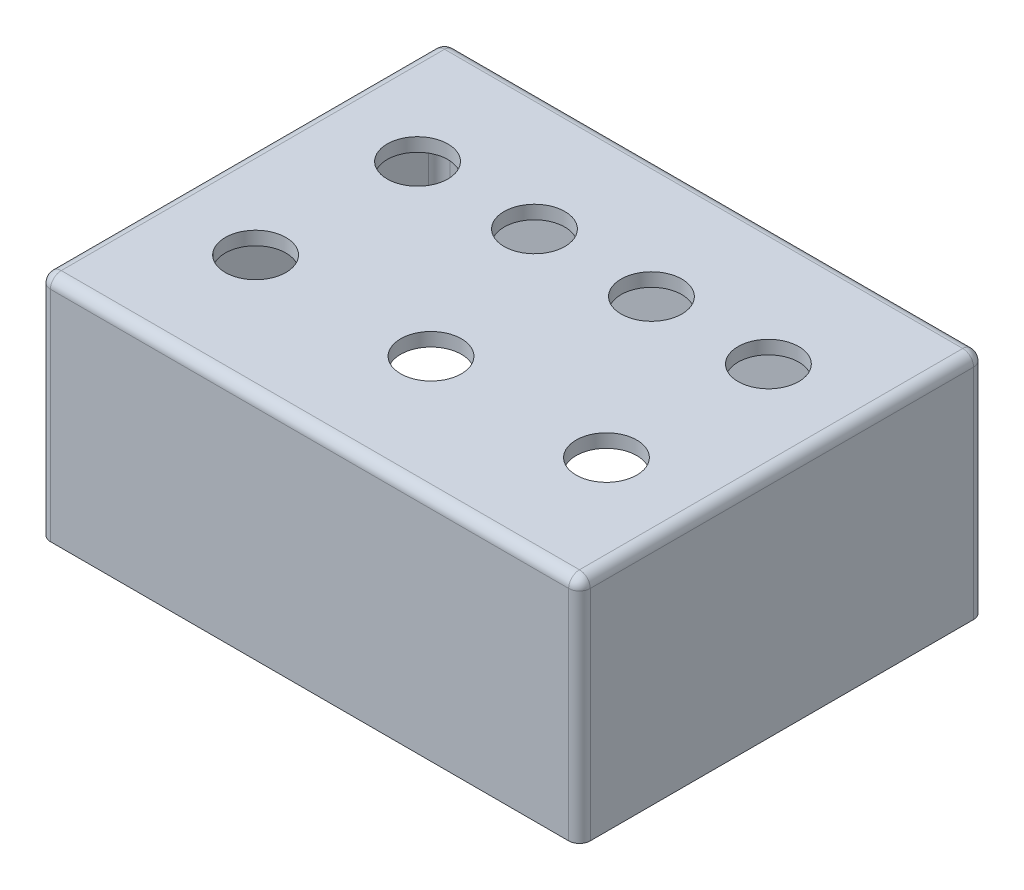
ISO-10303-21;
HEADER;
FILE_DESCRIPTION(('STEP AP214'),'2;1');
FILE_NAME('part.step','',(''),(''),'','','');
FILE_SCHEMA(('AUTOMOTIVE_DESIGN { 1 0 10303 214 1 1 1 1 }'));
ENDSEC;
DATA;
#1=APPLICATION_CONTEXT('core data for automotive mechanical design processes');
#2=APPLICATION_PROTOCOL_DEFINITION('international standard','automotive_design',2000,#1);
#3=PRODUCT_CONTEXT('',#1,'mechanical');
#4=PRODUCT('Part','Part','',(#3));
#5=PRODUCT_RELATED_PRODUCT_CATEGORY('part','',(#4));
#6=PRODUCT_DEFINITION_FORMATION('','',#4);
#7=PRODUCT_DEFINITION_CONTEXT('part definition',#1,'design');
#8=PRODUCT_DEFINITION('design','',#6,#7);
#9=PRODUCT_DEFINITION_SHAPE('','',#8);
#10=(LENGTH_UNIT() NAMED_UNIT(*) SI_UNIT(.MILLI.,.METRE.));
#11=(NAMED_UNIT(*) PLANE_ANGLE_UNIT() SI_UNIT($,.RADIAN.));
#12=(NAMED_UNIT(*) SI_UNIT($,.STERADIAN.) SOLID_ANGLE_UNIT());
#13=UNCERTAINTY_MEASURE_WITH_UNIT(LENGTH_MEASURE(1.E-05),#10,'distance_accuracy_value','');
#14=(GEOMETRIC_REPRESENTATION_CONTEXT(3) GLOBAL_UNCERTAINTY_ASSIGNED_CONTEXT((#13)) GLOBAL_UNIT_ASSIGNED_CONTEXT((#10,
#11,#12)) REPRESENTATION_CONTEXT('',''));
#15=CARTESIAN_POINT('',(0.,0.,0.));
#16=DIRECTION('',(0.,0.,1.));
#17=DIRECTION('',(1.,0.,0.));
#18=AXIS2_PLACEMENT_3D('',#15,#16,#17);
#19=CARTESIAN_POINT('',(0.,0.,0.));
#20=DIRECTION('',(0.,1.,0.));
#21=DIRECTION('',(0.,0.,1.));
#22=AXIS2_PLACEMENT_3D('',#19,#20,#21);
#23=PLANE('',#22);
#24=DIRECTION('',(0.,0.,1.));
#25=VECTOR('',#24,1.);
#26=CARTESIAN_POINT('',(-93.,0.,-70.));
#27=LINE('',#26,#25);
#28=CARTESIAN_POINT('',(-93.,0.,66.));
#29=VERTEX_POINT('',#28);
#30=CARTESIAN_POINT('',(-93.,0.,-66.));
#31=VERTEX_POINT('',#30);
#32=EDGE_CURVE('E360',#29,#31,#27,.F.);
#33=ORIENTED_EDGE('',*,*,#32,.T.);
#34=DIRECTION('',(-1.,0.,0.));
#35=VECTOR('',#34,1.);
#36=CARTESIAN_POINT('',(97.,0.,-66.));
#37=LINE('',#36,#35);
#38=CARTESIAN_POINT('',(93.,0.,-66.));
#39=VERTEX_POINT('',#38);
#40=EDGE_CURVE('E368',#31,#39,#37,.F.);
#41=ORIENTED_EDGE('',*,*,#40,.T.);
#42=DIRECTION('',(0.,0.,-1.));
#43=VECTOR('',#42,1.);
#44=CARTESIAN_POINT('',(93.,0.,70.));
#45=LINE('',#44,#43);
#46=CARTESIAN_POINT('',(93.,0.,66.));
#47=VERTEX_POINT('',#46);
#48=EDGE_CURVE('E71',#39,#47,#45,.F.);
#49=ORIENTED_EDGE('',*,*,#48,.T.);
#50=DIRECTION('',(1.,0.,0.));
#51=VECTOR('',#50,1.);
#52=CARTESIAN_POINT('',(-97.,0.,66.));
#53=LINE('',#52,#51);
#54=EDGE_CURVE('E363',#47,#29,#53,.F.);
#55=ORIENTED_EDGE('',*,*,#54,.T.);
#56=EDGE_LOOP('',(#33,#41,#49,#55));
#57=FACE_BOUND('',#56,.T.);
#58=CARTESIAN_POINT('',(-65.,0.,30.));
#59=DIRECTION('',(0.,1.,0.));
#60=DIRECTION('',(0.,0.,1.));
#61=AXIS2_PLACEMENT_3D('',#58,#59,#60);
#62=CIRCLE('',#61,11.25);
#63=CARTESIAN_POINT('',(-65.,0.,41.25));
#64=VERTEX_POINT('',#63);
#65=EDGE_CURVE('E460',#64,#64,#62,.F.);
#66=ORIENTED_EDGE('',*,*,#65,.F.);
#67=EDGE_LOOP('',(#66));
#68=FACE_BOUND('',#67,.T.);
#69=CARTESIAN_POINT('',(65.,0.,-30.));
#70=DIRECTION('',(0.,1.,0.));
#71=DIRECTION('',(0.,0.,1.));
#72=AXIS2_PLACEMENT_3D('',#69,#70,#71);
#73=CIRCLE('',#72,11.25);
#74=CARTESIAN_POINT('',(65.,0.,-18.75));
#75=VERTEX_POINT('',#74);
#76=EDGE_CURVE('E467',#75,#75,#73,.F.);
#77=ORIENTED_EDGE('',*,*,#76,.F.);
#78=EDGE_LOOP('',(#77));
#79=FACE_BOUND('',#78,.T.);
#80=CARTESIAN_POINT('',(21.6666666666667,0.,-30.));
#81=DIRECTION('',(0.,1.,0.));
#82=DIRECTION('',(0.,0.,1.));
#83=AXIS2_PLACEMENT_3D('',#80,#81,#82);
#84=CIRCLE('',#83,11.25);
#85=CARTESIAN_POINT('',(21.6666666666667,0.,-18.75));
#86=VERTEX_POINT('',#85);
#87=EDGE_CURVE('E476',#86,#86,#84,.F.);
#88=ORIENTED_EDGE('',*,*,#87,.F.);
#89=EDGE_LOOP('',(#88));
#90=FACE_BOUND('',#89,.T.);
#91=CARTESIAN_POINT('',(-65.,0.,-30.));
#92=DIRECTION('',(0.,1.,0.));
#93=DIRECTION('',(0.,0.,1.));
#94=AXIS2_PLACEMENT_3D('',#91,#92,#93);
#95=CIRCLE('',#94,11.25);
#96=CARTESIAN_POINT('',(-65.,0.,-18.75));
#97=VERTEX_POINT('',#96);
#98=EDGE_CURVE('E483',#97,#97,#95,.F.);
#99=ORIENTED_EDGE('',*,*,#98,.F.);
#100=EDGE_LOOP('',(#99));
#101=FACE_BOUND('',#100,.T.);
#102=CARTESIAN_POINT('',(0.,0.,30.));
#103=DIRECTION('',(0.,1.,0.));
#104=DIRECTION('',(0.,0.,1.));
#105=AXIS2_PLACEMENT_3D('',#102,#103,#104);
#106=CIRCLE('',#105,11.25);
#107=CARTESIAN_POINT('',(0.,0.,41.25));
#108=VERTEX_POINT('',#107);
#109=EDGE_CURVE('E451',#108,#108,#106,.F.);
#110=ORIENTED_EDGE('',*,*,#109,.F.);
#111=EDGE_LOOP('',(#110));
#112=FACE_BOUND('',#111,.T.);
#113=CARTESIAN_POINT('',(65.,0.,30.));
#114=DIRECTION('',(0.,1.,0.));
#115=DIRECTION('',(0.,0.,1.));
#116=AXIS2_PLACEMENT_3D('',#113,#114,#115);
#117=CIRCLE('',#116,11.25);
#118=CARTESIAN_POINT('',(65.,0.,41.25));
#119=VERTEX_POINT('',#118);
#120=EDGE_CURVE('E447',#119,#119,#117,.F.);
#121=ORIENTED_EDGE('',*,*,#120,.F.);
#122=EDGE_LOOP('',(#121));
#123=FACE_BOUND('',#122,.T.);
#124=CARTESIAN_POINT('',(-21.6666666666667,0.,-30.));
#125=DIRECTION('',(0.,1.,0.));
#126=DIRECTION('',(0.,0.,1.));
#127=AXIS2_PLACEMENT_3D('',#124,#125,#126);
#128=CIRCLE('',#127,11.25);
#129=CARTESIAN_POINT('',(-21.6666666666667,0.,-18.75));
#130=VERTEX_POINT('',#129);
#131=EDGE_CURVE('E502',#130,#130,#128,.F.);
#132=ORIENTED_EDGE('',*,*,#131,.F.);
#133=EDGE_LOOP('',(#132));
#134=FACE_BOUND('',#133,.T.);
#135=ADVANCED_FACE('F45',(#57,#68,#79,#90,#101,#112,#123,#134),#23,.F.);
#136=CARTESIAN_POINT('',(97.,-80.,75.));
#137=DIRECTION('',(1.,0.,0.));
#138=DIRECTION('',(0.,0.,-1.));
#139=AXIS2_PLACEMENT_3D('',#136,#137,#138);
#140=PLANE('',#139);
#141=DIRECTION('',(0.,0.,-1.));
#142=VECTOR('',#141,1.);
#143=CARTESIAN_POINT('',(97.,-80.,75.));
#144=LINE('',#143,#142);
#145=CARTESIAN_POINT('',(97.,-80.,66.));
#146=VERTEX_POINT('',#145);
#147=CARTESIAN_POINT('',(97.,-80.,-66.));
#148=VERTEX_POINT('',#147);
#149=EDGE_CURVE('E506',#146,#148,#144,.T.);
#150=ORIENTED_EDGE('',*,*,#149,.F.);
#151=DIRECTION('',(0.,1.,0.));
#152=VECTOR('',#151,1.);
#153=CARTESIAN_POINT('',(97.,0.,66.));
#154=LINE('',#153,#152);
#155=CARTESIAN_POINT('',(97.,-4.,66.));
#156=VERTEX_POINT('',#155);
#157=EDGE_CURVE('E348',#146,#156,#154,.T.);
#158=ORIENTED_EDGE('',*,*,#157,.T.);
#159=DIRECTION('',(0.,0.,-1.));
#160=VECTOR('',#159,1.);
#161=CARTESIAN_POINT('',(97.,-4.,-70.));
#162=LINE('',#161,#160);
#163=CARTESIAN_POINT('',(97.,-4.,-66.));
#164=VERTEX_POINT('',#163);
#165=EDGE_CURVE('E342',#156,#164,#162,.T.);
#166=ORIENTED_EDGE('',*,*,#165,.T.);
#167=DIRECTION('',(0.,1.,0.));
#168=VECTOR('',#167,1.);
#169=CARTESIAN_POINT('',(97.,-80.,-66.));
#170=LINE('',#169,#168);
#171=EDGE_CURVE('E345',#164,#148,#170,.F.);
#172=ORIENTED_EDGE('',*,*,#171,.T.);
#173=EDGE_LOOP('',(#150,#158,#166,#172));
#174=FACE_BOUND('',#173,.T.);
#175=ADVANCED_FACE('F578',(#174),#140,.F.);
#176=CARTESIAN_POINT('',(-97.,-80.,75.));
#177=DIRECTION('',(-1.,0.,0.));
#178=DIRECTION('',(0.,0.,1.));
#179=AXIS2_PLACEMENT_3D('',#176,#177,#178);
#180=PLANE('',#179);
#181=DIRECTION('',(0.,0.,1.));
#182=VECTOR('',#181,1.);
#183=CARTESIAN_POINT('',(-97.,-80.,75.));
#184=LINE('',#183,#182);
#185=CARTESIAN_POINT('',(-97.,-80.,-66.));
#186=VERTEX_POINT('',#185);
#187=CARTESIAN_POINT('',(-97.,-80.,66.));
#188=VERTEX_POINT('',#187);
#189=EDGE_CURVE('E208',#186,#188,#184,.T.);
#190=ORIENTED_EDGE('',*,*,#189,.F.);
#191=DIRECTION('',(0.,1.,0.));
#192=VECTOR('',#191,1.);
#193=CARTESIAN_POINT('',(-97.,0.,-66.));
#194=LINE('',#193,#192);
#195=CARTESIAN_POINT('',(-97.,-4.,-66.));
#196=VERTEX_POINT('',#195);
#197=EDGE_CURVE('E329',#186,#196,#194,.T.);
#198=ORIENTED_EDGE('',*,*,#197,.T.);
#199=DIRECTION('',(0.,0.,1.));
#200=VECTOR('',#199,1.);
#201=CARTESIAN_POINT('',(-97.,-4.,70.));
#202=LINE('',#201,#200);
#203=CARTESIAN_POINT('',(-97.,-4.,66.));
#204=VERTEX_POINT('',#203);
#205=EDGE_CURVE('E326',#196,#204,#202,.T.);
#206=ORIENTED_EDGE('',*,*,#205,.T.);
#207=DIRECTION('',(0.,1.,0.));
#208=VECTOR('',#207,1.);
#209=CARTESIAN_POINT('',(-97.,-80.,66.));
#210=LINE('',#209,#208);
#211=EDGE_CURVE('E277',#204,#188,#210,.F.);
#212=ORIENTED_EDGE('',*,*,#211,.T.);
#213=EDGE_LOOP('',(#190,#198,#206,#212));
#214=FACE_BOUND('',#213,.T.);
#215=ADVANCED_FACE('F584',(#214),#180,.F.);
#216=CARTESIAN_POINT('',(-100.,5.,75.));
#217=DIRECTION('',(1.,0.,0.));
#218=DIRECTION('',(0.,0.,-1.));
#219=AXIS2_PLACEMENT_3D('',#216,#217,#218);
#220=PLANE('',#219);
#221=DIRECTION('',(0.,0.,-1.));
#222=VECTOR('',#221,1.);
#223=CARTESIAN_POINT('',(-100.,-80.,75.));
#224=LINE('',#223,#222);
#225=CARTESIAN_POINT('',(-100.,-80.,71.));
#226=VERTEX_POINT('',#225);
#227=CARTESIAN_POINT('',(-100.,-80.,-71.));
#228=VERTEX_POINT('',#227);
#229=EDGE_CURVE('E193',#226,#228,#224,.T.);
#230=ORIENTED_EDGE('',*,*,#229,.F.);
#231=DIRECTION('',(0.,-1.,0.));
#232=VECTOR('',#231,1.);
#233=CARTESIAN_POINT('',(-100.,5.,71.));
#234=LINE('',#233,#232);
#235=CARTESIAN_POINT('',(-100.,1.,71.));
#236=VERTEX_POINT('',#235);
#237=EDGE_CURVE('E274',#226,#236,#234,.F.);
#238=ORIENTED_EDGE('',*,*,#237,.T.);
#239=DIRECTION('',(0.,0.,1.));
#240=VECTOR('',#239,1.);
#241=CARTESIAN_POINT('',(-100.,1.,-75.));
#242=LINE('',#241,#240);
#243=CARTESIAN_POINT('',(-100.,1.,-71.));
#244=VERTEX_POINT('',#243);
#245=EDGE_CURVE('E271',#236,#244,#242,.F.);
#246=ORIENTED_EDGE('',*,*,#245,.T.);
#247=DIRECTION('',(0.,-1.,0.));
#248=VECTOR('',#247,1.);
#249=CARTESIAN_POINT('',(-100.,5.,-71.));
#250=LINE('',#249,#248);
#251=EDGE_CURVE('E268',#244,#228,#250,.T.);
#252=ORIENTED_EDGE('',*,*,#251,.T.);
#253=EDGE_LOOP('',(#230,#238,#246,#252));
#254=FACE_BOUND('',#253,.T.);
#255=ADVANCED_FACE('F544',(#254),#220,.F.);
#256=CARTESIAN_POINT('',(100.,5.,75.));
#257=DIRECTION('',(0.,0.,-1.));
#258=DIRECTION('',(-1.,0.,0.));
#259=AXIS2_PLACEMENT_3D('',#256,#257,#258);
#260=PLANE('',#259);
#261=DIRECTION('',(-1.,0.,0.));
#262=VECTOR('',#261,1.);
#263=CARTESIAN_POINT('',(-100.,-80.,75.));
#264=LINE('',#263,#262);
#265=CARTESIAN_POINT('',(96.,-80.,75.));
#266=VERTEX_POINT('',#265);
#267=CARTESIAN_POINT('',(-96.,-80.,75.));
#268=VERTEX_POINT('',#267);
#269=EDGE_CURVE('E216',#266,#268,#264,.T.);
#270=ORIENTED_EDGE('',*,*,#269,.F.);
#271=DIRECTION('',(0.,-1.,0.));
#272=VECTOR('',#271,1.);
#273=CARTESIAN_POINT('',(96.,5.,75.));
#274=LINE('',#273,#272);
#275=CARTESIAN_POINT('',(96.,1.,75.));
#276=VERTEX_POINT('',#275);
#277=EDGE_CURVE('E252',#266,#276,#274,.F.);
#278=ORIENTED_EDGE('',*,*,#277,.T.);
#279=DIRECTION('',(1.,0.,0.));
#280=VECTOR('',#279,1.);
#281=CARTESIAN_POINT('',(-100.,1.,75.));
#282=LINE('',#281,#280);
#283=CARTESIAN_POINT('',(-96.,1.,75.));
#284=VERTEX_POINT('',#283);
#285=EDGE_CURVE('E249',#276,#284,#282,.F.);
#286=ORIENTED_EDGE('',*,*,#285,.T.);
#287=DIRECTION('',(0.,-1.,0.));
#288=VECTOR('',#287,1.);
#289=CARTESIAN_POINT('',(-96.,5.,75.));
#290=LINE('',#289,#288);
#291=EDGE_CURVE('E246',#284,#268,#290,.T.);
#292=ORIENTED_EDGE('',*,*,#291,.T.);
#293=EDGE_LOOP('',(#270,#278,#286,#292));
#294=FACE_BOUND('',#293,.T.);
#295=ADVANCED_FACE('F526',(#294),#260,.F.);
#296=CARTESIAN_POINT('',(100.,5.,75.));
#297=DIRECTION('',(-1.,0.,0.));
#298=DIRECTION('',(0.,0.,1.));
#299=AXIS2_PLACEMENT_3D('',#296,#297,#298);
#300=PLANE('',#299);
#301=DIRECTION('',(0.,0.,1.));
#302=VECTOR('',#301,1.);
#303=CARTESIAN_POINT('',(100.,-80.,75.));
#304=LINE('',#303,#302);
#305=CARTESIAN_POINT('',(100.,-80.,-71.));
#306=VERTEX_POINT('',#305);
#307=CARTESIAN_POINT('',(100.,-80.,71.));
#308=VERTEX_POINT('',#307);
#309=EDGE_CURVE('E224',#306,#308,#304,.T.);
#310=ORIENTED_EDGE('',*,*,#309,.F.);
#311=DIRECTION('',(0.,-1.,0.));
#312=VECTOR('',#311,1.);
#313=CARTESIAN_POINT('',(100.,5.,-71.));
#314=LINE('',#313,#312);
#315=CARTESIAN_POINT('',(100.,1.,-71.));
#316=VERTEX_POINT('',#315);
#317=EDGE_CURVE('E243',#306,#316,#314,.F.);
#318=ORIENTED_EDGE('',*,*,#317,.T.);
#319=DIRECTION('',(0.,0.,-1.));
#320=VECTOR('',#319,1.);
#321=CARTESIAN_POINT('',(100.,1.,75.));
#322=LINE('',#321,#320);
#323=CARTESIAN_POINT('',(100.,1.,71.));
#324=VERTEX_POINT('',#323);
#325=EDGE_CURVE('E237',#316,#324,#322,.F.);
#326=ORIENTED_EDGE('',*,*,#325,.T.);
#327=DIRECTION('',(0.,-1.,0.));
#328=VECTOR('',#327,1.);
#329=CARTESIAN_POINT('',(100.,5.,71.));
#330=LINE('',#329,#328);
#331=EDGE_CURVE('E240',#324,#308,#330,.T.);
#332=ORIENTED_EDGE('',*,*,#331,.T.);
#333=EDGE_LOOP('',(#310,#318,#326,#332));
#334=FACE_BOUND('',#333,.T.);
#335=ADVANCED_FACE('F563',(#334),#300,.F.);
#336=CARTESIAN_POINT('',(100.,5.,-75.));
#337=DIRECTION('',(0.,0.,1.));
#338=DIRECTION('',(1.,0.,0.));
#339=AXIS2_PLACEMENT_3D('',#336,#337,#338);
#340=PLANE('',#339);
#341=CARTESIAN_POINT('',(0.,-55.4446746292205,-75.));
#342=DIRECTION('',(0.,0.,-1.));
#343=DIRECTION('',(-1.,0.,0.));
#344=AXIS2_PLACEMENT_3D('',#341,#342,#343);
#345=CIRCLE('',#344,14.2293278366979);
#346=CARTESIAN_POINT('',(-14.2293278366979,-55.4446746292205,-75.));
#347=VERTEX_POINT('',#346);
#348=EDGE_CURVE('E1044',#347,#347,#345,.T.);
#349=ORIENTED_EDGE('',*,*,#348,.F.);
#350=EDGE_LOOP('',(#349));
#351=FACE_BOUND('',#350,.T.);
#352=DIRECTION('',(-1.,0.,0.));
#353=VECTOR('',#352,1.);
#354=CARTESIAN_POINT('',(100.,1.,-75.));
#355=LINE('',#354,#353);
#356=CARTESIAN_POINT('',(-96.,1.,-75.));
#357=VERTEX_POINT('',#356);
#358=CARTESIAN_POINT('',(96.,1.,-75.));
#359=VERTEX_POINT('',#358);
#360=EDGE_CURVE('E215',#357,#359,#355,.F.);
#361=ORIENTED_EDGE('',*,*,#360,.T.);
#362=DIRECTION('',(0.,-1.,0.));
#363=VECTOR('',#362,1.);
#364=CARTESIAN_POINT('',(96.,5.,-75.));
#365=LINE('',#364,#363);
#366=CARTESIAN_POINT('',(96.,-80.,-75.));
#367=VERTEX_POINT('',#366);
#368=EDGE_CURVE('E199',#359,#367,#365,.T.);
#369=ORIENTED_EDGE('',*,*,#368,.T.);
#370=DIRECTION('',(1.,0.,0.));
#371=VECTOR('',#370,1.);
#372=CARTESIAN_POINT('',(-100.,-80.,-75.));
#373=LINE('',#372,#371);
#374=CARTESIAN_POINT('',(-96.,-80.,-75.));
#375=VERTEX_POINT('',#374);
#376=EDGE_CURVE('E191',#375,#367,#373,.T.);
#377=ORIENTED_EDGE('',*,*,#376,.F.);
#378=DIRECTION('',(0.,-1.,0.));
#379=VECTOR('',#378,1.);
#380=CARTESIAN_POINT('',(-96.,5.,-75.));
#381=LINE('',#380,#379);
#382=EDGE_CURVE('E204',#375,#357,#381,.F.);
#383=ORIENTED_EDGE('',*,*,#382,.T.);
#384=EDGE_LOOP('',(#361,#369,#377,#383));
#385=FACE_BOUND('',#384,.T.);
#386=ADVANCED_FACE('F203',(#351,#385),#340,.F.);
#387=CARTESIAN_POINT('',(0.,5.,0.));
#388=DIRECTION('',(0.,1.,0.));
#389=DIRECTION('',(0.,0.,1.));
#390=AXIS2_PLACEMENT_3D('',#387,#388,#389);
#391=PLANE('',#390);
#392=DIRECTION('',(1.,0.,0.));
#393=VECTOR('',#392,1.);
#394=CARTESIAN_POINT('',(100.,5.,71.));
#395=LINE('',#394,#393);
#396=CARTESIAN_POINT('',(-96.,5.,71.));
#397=VERTEX_POINT('',#396);
#398=CARTESIAN_POINT('',(96.,5.,71.));
#399=VERTEX_POINT('',#398);
#400=EDGE_CURVE('E261',#397,#399,#395,.T.);
#401=ORIENTED_EDGE('',*,*,#400,.T.);
#402=DIRECTION('',(0.,0.,-1.));
#403=VECTOR('',#402,1.);
#404=CARTESIAN_POINT('',(96.,5.,-75.));
#405=LINE('',#404,#403);
#406=CARTESIAN_POINT('',(96.,5.,-71.));
#407=VERTEX_POINT('',#406);
#408=EDGE_CURVE('E264',#399,#407,#405,.T.);
#409=ORIENTED_EDGE('',*,*,#408,.T.);
#410=DIRECTION('',(-1.,0.,0.));
#411=VECTOR('',#410,1.);
#412=CARTESIAN_POINT('',(-100.,5.,-71.));
#413=LINE('',#412,#411);
#414=CARTESIAN_POINT('',(-96.,5.,-71.));
#415=VERTEX_POINT('',#414);
#416=EDGE_CURVE('E255',#407,#415,#413,.T.);
#417=ORIENTED_EDGE('',*,*,#416,.T.);
#418=DIRECTION('',(0.,0.,1.));
#419=VECTOR('',#418,1.);
#420=CARTESIAN_POINT('',(-96.,5.,75.));
#421=LINE('',#420,#419);
#422=EDGE_CURVE('E258',#415,#397,#421,.T.);
#423=ORIENTED_EDGE('',*,*,#422,.T.);
#424=EDGE_LOOP('',(#401,#409,#417,#423));
#425=FACE_BOUND('',#424,.T.);
#426=CARTESIAN_POINT('',(-65.,5.,30.));
#427=DIRECTION('',(0.,1.,0.));
#428=DIRECTION('',(0.,0.,1.));
#429=AXIS2_PLACEMENT_3D('',#426,#427,#428);
#430=CIRCLE('',#429,11.25);
#431=CARTESIAN_POINT('',(-65.,5.,41.25));
#432=VERTEX_POINT('',#431);
#433=EDGE_CURVE('E472',#432,#432,#430,.T.);
#434=ORIENTED_EDGE('',*,*,#433,.F.);
#435=EDGE_LOOP('',(#434));
#436=FACE_BOUND('',#435,.T.);
#437=CARTESIAN_POINT('',(65.,5.,-30.));
#438=DIRECTION('',(0.,1.,0.));
#439=DIRECTION('',(0.,0.,1.));
#440=AXIS2_PLACEMENT_3D('',#437,#438,#439);
#441=CIRCLE('',#440,11.25);
#442=CARTESIAN_POINT('',(65.,5.,-18.75));
#443=VERTEX_POINT('',#442);
#444=EDGE_CURVE('E471',#443,#443,#441,.T.);
#445=ORIENTED_EDGE('',*,*,#444,.F.);
#446=EDGE_LOOP('',(#445));
#447=FACE_BOUND('',#446,.T.);
#448=CARTESIAN_POINT('',(21.6666666666667,5.,-30.));
#449=DIRECTION('',(0.,1.,0.));
#450=DIRECTION('',(0.,0.,1.));
#451=AXIS2_PLACEMENT_3D('',#448,#449,#450);
#452=CIRCLE('',#451,11.25);
#453=CARTESIAN_POINT('',(21.6666666666667,5.,-18.75));
#454=VERTEX_POINT('',#453);
#455=EDGE_CURVE('E488',#454,#454,#452,.T.);
#456=ORIENTED_EDGE('',*,*,#455,.F.);
#457=EDGE_LOOP('',(#456));
#458=FACE_BOUND('',#457,.T.);
#459=CARTESIAN_POINT('',(-65.,5.,-30.));
#460=DIRECTION('',(0.,1.,0.));
#461=DIRECTION('',(0.,0.,1.));
#462=AXIS2_PLACEMENT_3D('',#459,#460,#461);
#463=CIRCLE('',#462,11.25);
#464=CARTESIAN_POINT('',(-65.,5.,-18.75));
#465=VERTEX_POINT('',#464);
#466=EDGE_CURVE('E487',#465,#465,#463,.T.);
#467=ORIENTED_EDGE('',*,*,#466,.F.);
#468=EDGE_LOOP('',(#467));
#469=FACE_BOUND('',#468,.T.);
#470=CARTESIAN_POINT('',(0.,5.,30.));
#471=DIRECTION('',(0.,1.,0.));
#472=DIRECTION('',(0.,0.,1.));
#473=AXIS2_PLACEMENT_3D('',#470,#471,#472);
#474=CIRCLE('',#473,11.25);
#475=CARTESIAN_POINT('',(0.,5.,41.25));
#476=VERTEX_POINT('',#475);
#477=EDGE_CURVE('E455',#476,#476,#474,.T.);
#478=ORIENTED_EDGE('',*,*,#477,.F.);
#479=EDGE_LOOP('',(#478));
#480=FACE_BOUND('',#479,.T.);
#481=CARTESIAN_POINT('',(65.,5.,30.));
#482=DIRECTION('',(0.,1.,0.));
#483=DIRECTION('',(0.,0.,1.));
#484=AXIS2_PLACEMENT_3D('',#481,#482,#483);
#485=CIRCLE('',#484,11.25);
#486=CARTESIAN_POINT('',(65.,5.,41.25));
#487=VERTEX_POINT('',#486);
#488=EDGE_CURVE('E456',#487,#487,#485,.T.);
#489=ORIENTED_EDGE('',*,*,#488,.F.);
#490=EDGE_LOOP('',(#489));
#491=FACE_BOUND('',#490,.T.);
#492=CARTESIAN_POINT('',(-21.6666666666667,5.,-30.));
#493=DIRECTION('',(0.,1.,0.));
#494=DIRECTION('',(0.,0.,1.));
#495=AXIS2_PLACEMENT_3D('',#492,#493,#494);
#496=CIRCLE('',#495,11.25);
#497=CARTESIAN_POINT('',(-21.6666666666667,5.,-18.75));
#498=VERTEX_POINT('',#497);
#499=EDGE_CURVE('E492',#498,#498,#496,.T.);
#500=ORIENTED_EDGE('',*,*,#499,.F.);
#501=EDGE_LOOP('',(#500));
#502=FACE_BOUND('',#501,.T.);
#503=ADVANCED_FACE('F590',(#425,#436,#447,#458,#469,#480,#491,#502),#391,.T.);
#504=CARTESIAN_POINT('',(0.,-80.,0.));
#505=DIRECTION('',(0.,-1.,0.));
#506=DIRECTION('',(0.,0.,-1.));
#507=AXIS2_PLACEMENT_3D('',#504,#505,#506);
#508=PLANE('',#507);
#509=DIRECTION('',(1.,0.,0.));
#510=VECTOR('',#509,1.);
#511=CARTESIAN_POINT('',(-97.,-80.,70.));
#512=LINE('',#511,#510);
#513=CARTESIAN_POINT('',(-93.,-80.,70.));
#514=VERTEX_POINT('',#513);
#515=CARTESIAN_POINT('',(93.,-80.,70.));
#516=VERTEX_POINT('',#515);
#517=EDGE_CURVE('E323',#514,#516,#512,.T.);
#518=ORIENTED_EDGE('',*,*,#517,.T.);
#519=CARTESIAN_POINT('',(93.,-80.,66.));
#520=DIRECTION('',(0.,-1.,0.));
#521=DIRECTION('',(0.,0.,-1.));
#522=AXIS2_PLACEMENT_3D('',#519,#520,#521);
#523=CIRCLE('',#522,4.);
#524=EDGE_CURVE('E374',#516,#146,#523,.F.);
#525=ORIENTED_EDGE('',*,*,#524,.T.);
#526=ORIENTED_EDGE('',*,*,#149,.T.);
#527=CARTESIAN_POINT('',(93.,-80.,-66.));
#528=DIRECTION('',(0.,-1.,0.));
#529=DIRECTION('',(0.,0.,-1.));
#530=AXIS2_PLACEMENT_3D('',#527,#528,#529);
#531=CIRCLE('',#530,4.);
#532=CARTESIAN_POINT('',(93.,-80.,-70.));
#533=VERTEX_POINT('',#532);
#534=EDGE_CURVE('E55',#148,#533,#531,.F.);
#535=ORIENTED_EDGE('',*,*,#534,.T.);
#536=DIRECTION('',(-1.,0.,0.));
#537=VECTOR('',#536,1.);
#538=CARTESIAN_POINT('',(-97.,-80.,-70.));
#539=LINE('',#538,#537);
#540=CARTESIAN_POINT('',(-93.,-80.,-70.));
#541=VERTEX_POINT('',#540);
#542=EDGE_CURVE('E443',#533,#541,#539,.T.);
#543=ORIENTED_EDGE('',*,*,#542,.T.);
#544=CARTESIAN_POINT('',(-93.,-80.,-66.));
#545=DIRECTION('',(0.,-1.,0.));
#546=DIRECTION('',(0.,0.,-1.));
#547=AXIS2_PLACEMENT_3D('',#544,#545,#546);
#548=CIRCLE('',#547,4.);
#549=EDGE_CURVE('E371',#541,#186,#548,.F.);
#550=ORIENTED_EDGE('',*,*,#549,.T.);
#551=ORIENTED_EDGE('',*,*,#189,.T.);
#552=CARTESIAN_POINT('',(-93.,-80.,66.));
#553=DIRECTION('',(0.,-1.,0.));
#554=DIRECTION('',(0.,0.,-1.));
#555=AXIS2_PLACEMENT_3D('',#552,#553,#554);
#556=CIRCLE('',#555,4.);
#557=EDGE_CURVE('E11',#188,#514,#556,.F.);
#558=ORIENTED_EDGE('',*,*,#557,.T.);
#559=EDGE_LOOP('',(#518,#525,#526,#535,#543,#550,#551,#558));
#560=FACE_BOUND('',#559,.T.);
#561=ORIENTED_EDGE('',*,*,#376,.T.);
#562=CARTESIAN_POINT('',(96.,-80.,-71.));
#563=DIRECTION('',(0.,-1.,0.));
#564=DIRECTION('',(0.,0.,-1.));
#565=AXIS2_PLACEMENT_3D('',#562,#563,#564);
#566=CIRCLE('',#565,4.);
#567=EDGE_CURVE('E234',#367,#306,#566,.T.);
#568=ORIENTED_EDGE('',*,*,#567,.T.);
#569=ORIENTED_EDGE('',*,*,#309,.T.);
#570=CARTESIAN_POINT('',(96.,-80.,71.));
#571=DIRECTION('',(0.,-1.,0.));
#572=DIRECTION('',(0.,0.,-1.));
#573=AXIS2_PLACEMENT_3D('',#570,#571,#572);
#574=CIRCLE('',#573,4.);
#575=EDGE_CURVE('E231',#308,#266,#574,.T.);
#576=ORIENTED_EDGE('',*,*,#575,.T.);
#577=ORIENTED_EDGE('',*,*,#269,.T.);
#578=CARTESIAN_POINT('',(-96.,-80.,71.));
#579=DIRECTION('',(0.,-1.,0.));
#580=DIRECTION('',(0.,0.,-1.));
#581=AXIS2_PLACEMENT_3D('',#578,#579,#580);
#582=CIRCLE('',#581,4.);
#583=EDGE_CURVE('E198',#268,#226,#582,.T.);
#584=ORIENTED_EDGE('',*,*,#583,.T.);
#585=ORIENTED_EDGE('',*,*,#229,.T.);
#586=CARTESIAN_POINT('',(-96.,-80.,-71.));
#587=DIRECTION('',(0.,-1.,0.));
#588=DIRECTION('',(0.,0.,-1.));
#589=AXIS2_PLACEMENT_3D('',#586,#587,#588);
#590=CIRCLE('',#589,4.);
#591=EDGE_CURVE('E188',#228,#375,#590,.T.);
#592=ORIENTED_EDGE('',*,*,#591,.T.);
#593=EDGE_LOOP('',(#561,#568,#569,#576,#577,#584,#585,#592));
#594=FACE_BOUND('',#593,.T.);
#595=ADVANCED_FACE('F190',(#560,#594),#508,.T.);
#596=CARTESIAN_POINT('',(-21.6666666666667,-31.8198051533947,-30.));
#597=DIRECTION('',(0.,1.,0.));
#598=DIRECTION('',(0.,0.,1.));
#599=AXIS2_PLACEMENT_3D('',#596,#597,#598);
#600=CYLINDRICAL_SURFACE('',#599,11.25);
#601=ORIENTED_EDGE('',*,*,#131,.T.);
#602=EDGE_LOOP('',(#601));
#603=FACE_BOUND('',#602,.T.);
#604=ORIENTED_EDGE('',*,*,#499,.T.);
#605=EDGE_LOOP('',(#604));
#606=FACE_BOUND('',#605,.T.);
#607=ADVANCED_FACE('F782',(#603,#606),#600,.F.);
#608=CARTESIAN_POINT('',(65.,-31.8198051533947,30.));
#609=DIRECTION('',(0.,1.,0.));
#610=DIRECTION('',(0.,0.,1.));
#611=AXIS2_PLACEMENT_3D('',#608,#609,#610);
#612=CYLINDRICAL_SURFACE('',#611,11.25);
#613=ORIENTED_EDGE('',*,*,#120,.T.);
#614=EDGE_LOOP('',(#613));
#615=FACE_BOUND('',#614,.T.);
#616=ORIENTED_EDGE('',*,*,#488,.T.);
#617=EDGE_LOOP('',(#616));
#618=FACE_BOUND('',#617,.T.);
#619=ADVANCED_FACE('F918',(#615,#618),#612,.F.);
#620=CARTESIAN_POINT('',(0.,-31.8198051533947,30.));
#621=DIRECTION('',(0.,1.,0.));
#622=DIRECTION('',(0.,0.,1.));
#623=AXIS2_PLACEMENT_3D('',#620,#621,#622);
#624=CYLINDRICAL_SURFACE('',#623,11.25);
#625=ORIENTED_EDGE('',*,*,#109,.T.);
#626=EDGE_LOOP('',(#625));
#627=FACE_BOUND('',#626,.T.);
#628=ORIENTED_EDGE('',*,*,#477,.T.);
#629=EDGE_LOOP('',(#628));
#630=FACE_BOUND('',#629,.T.);
#631=ADVANCED_FACE('F909',(#627,#630),#624,.F.);
#632=CARTESIAN_POINT('',(-65.,-31.8198051533947,-30.));
#633=DIRECTION('',(0.,1.,0.));
#634=DIRECTION('',(0.,0.,1.));
#635=AXIS2_PLACEMENT_3D('',#632,#633,#634);
#636=CYLINDRICAL_SURFACE('',#635,11.25);
#637=ORIENTED_EDGE('',*,*,#98,.T.);
#638=EDGE_LOOP('',(#637));
#639=FACE_BOUND('',#638,.T.);
#640=ORIENTED_EDGE('',*,*,#466,.T.);
#641=EDGE_LOOP('',(#640));
#642=FACE_BOUND('',#641,.T.);
#643=ADVANCED_FACE('F900',(#639,#642),#636,.F.);
#644=CARTESIAN_POINT('',(21.6666666666667,-31.8198051533947,-30.));
#645=DIRECTION('',(0.,1.,0.));
#646=DIRECTION('',(0.,0.,1.));
#647=AXIS2_PLACEMENT_3D('',#644,#645,#646);
#648=CYLINDRICAL_SURFACE('',#647,11.25);
#649=ORIENTED_EDGE('',*,*,#87,.T.);
#650=EDGE_LOOP('',(#649));
#651=FACE_BOUND('',#650,.T.);
#652=ORIENTED_EDGE('',*,*,#455,.T.);
#653=EDGE_LOOP('',(#652));
#654=FACE_BOUND('',#653,.T.);
#655=ADVANCED_FACE('F891',(#651,#654),#648,.F.);
#656=CARTESIAN_POINT('',(65.,-31.8198051533947,-30.));
#657=DIRECTION('',(0.,1.,0.));
#658=DIRECTION('',(0.,0.,1.));
#659=AXIS2_PLACEMENT_3D('',#656,#657,#658);
#660=CYLINDRICAL_SURFACE('',#659,11.25);
#661=ORIENTED_EDGE('',*,*,#76,.T.);
#662=EDGE_LOOP('',(#661));
#663=FACE_BOUND('',#662,.T.);
#664=ORIENTED_EDGE('',*,*,#444,.T.);
#665=EDGE_LOOP('',(#664));
#666=FACE_BOUND('',#665,.T.);
#667=ADVANCED_FACE('F881',(#663,#666),#660,.F.);
#668=CARTESIAN_POINT('',(-65.,-31.8198051533947,30.));
#669=DIRECTION('',(0.,1.,0.));
#670=DIRECTION('',(0.,0.,1.));
#671=AXIS2_PLACEMENT_3D('',#668,#669,#670);
#672=CYLINDRICAL_SURFACE('',#671,11.25);
#673=ORIENTED_EDGE('',*,*,#65,.T.);
#674=EDGE_LOOP('',(#673));
#675=FACE_BOUND('',#674,.T.);
#676=ORIENTED_EDGE('',*,*,#433,.T.);
#677=EDGE_LOOP('',(#676));
#678=FACE_BOUND('',#677,.T.);
#679=ADVANCED_FACE('F793',(#675,#678),#672,.F.);
#680=CARTESIAN_POINT('',(-97.,-80.,70.));
#681=DIRECTION('',(0.,0.,1.));
#682=DIRECTION('',(1.,0.,0.));
#683=AXIS2_PLACEMENT_3D('',#680,#681,#682);
#684=PLANE('',#683);
#685=DIRECTION('',(1.,0.,0.));
#686=VECTOR('',#685,1.);
#687=CARTESIAN_POINT('',(97.,-4.,70.));
#688=LINE('',#687,#686);
#689=CARTESIAN_POINT('',(-93.,-4.,70.));
#690=VERTEX_POINT('',#689);
#691=CARTESIAN_POINT('',(93.,-4.,70.));
#692=VERTEX_POINT('',#691);
#693=EDGE_CURVE('E354',#690,#692,#688,.T.);
#694=ORIENTED_EDGE('',*,*,#693,.T.);
#695=DIRECTION('',(0.,1.,0.));
#696=VECTOR('',#695,1.);
#697=CARTESIAN_POINT('',(93.,-80.,70.));
#698=LINE('',#697,#696);
#699=EDGE_CURVE('E357',#692,#516,#698,.F.);
#700=ORIENTED_EDGE('',*,*,#699,.T.);
#701=ORIENTED_EDGE('',*,*,#517,.F.);
#702=DIRECTION('',(0.,1.,0.));
#703=VECTOR('',#702,1.);
#704=CARTESIAN_POINT('',(-93.,0.,70.));
#705=LINE('',#704,#703);
#706=EDGE_CURVE('E351',#514,#690,#705,.T.);
#707=ORIENTED_EDGE('',*,*,#706,.T.);
#708=EDGE_LOOP('',(#694,#700,#701,#707));
#709=FACE_BOUND('',#708,.T.);
#710=ADVANCED_FACE('F435',(#709),#684,.F.);
#711=CARTESIAN_POINT('',(-97.,-80.,-70.));
#712=DIRECTION('',(0.,0.,-1.));
#713=DIRECTION('',(-1.,0.,0.));
#714=AXIS2_PLACEMENT_3D('',#711,#712,#713);
#715=PLANE('',#714);
#716=CARTESIAN_POINT('',(0.,-55.4446746292205,-70.));
#717=DIRECTION('',(0.,0.,-1.));
#718=DIRECTION('',(-1.,0.,0.));
#719=AXIS2_PLACEMENT_3D('',#716,#717,#718);
#720=CIRCLE('',#719,14.2293278366979);
#721=CARTESIAN_POINT('',(-14.2293278366979,-55.4446746292205,-70.));
#722=VERTEX_POINT('',#721);
#723=EDGE_CURVE('E383',#722,#722,#720,.F.);
#724=ORIENTED_EDGE('',*,*,#723,.F.);
#725=EDGE_LOOP('',(#724));
#726=FACE_BOUND('',#725,.T.);
#727=DIRECTION('',(-1.,0.,0.));
#728=VECTOR('',#727,1.);
#729=CARTESIAN_POINT('',(-97.,-4.,-70.));
#730=LINE('',#729,#728);
#731=CARTESIAN_POINT('',(93.,-4.,-70.));
#732=VERTEX_POINT('',#731);
#733=CARTESIAN_POINT('',(-93.,-4.,-70.));
#734=VERTEX_POINT('',#733);
#735=EDGE_CURVE('E333',#732,#734,#730,.T.);
#736=ORIENTED_EDGE('',*,*,#735,.T.);
#737=DIRECTION('',(0.,1.,0.));
#738=VECTOR('',#737,1.);
#739=CARTESIAN_POINT('',(-93.,-80.,-70.));
#740=LINE('',#739,#738);
#741=EDGE_CURVE('E339',#734,#541,#740,.F.);
#742=ORIENTED_EDGE('',*,*,#741,.T.);
#743=ORIENTED_EDGE('',*,*,#542,.F.);
#744=DIRECTION('',(0.,1.,0.));
#745=VECTOR('',#744,1.);
#746=CARTESIAN_POINT('',(93.,0.,-70.));
#747=LINE('',#746,#745);
#748=EDGE_CURVE('E336',#533,#732,#747,.T.);
#749=ORIENTED_EDGE('',*,*,#748,.T.);
#750=EDGE_LOOP('',(#736,#742,#743,#749));
#751=FACE_BOUND('',#750,.T.);
#752=ADVANCED_FACE('F753',(#726,#751),#715,.F.);
#753=CARTESIAN_POINT('',(-96.,5.,71.));
#754=DIRECTION('',(0.,-1.,0.));
#755=DIRECTION('',(0.,0.,-1.));
#756=AXIS2_PLACEMENT_3D('',#753,#754,#755);
#757=CYLINDRICAL_SURFACE('',#756,4.);
#758=CARTESIAN_POINT('',(-96.,1.,71.));
#759=DIRECTION('',(0.,1.,0.));
#760=DIRECTION('',(0.,0.,1.));
#761=AXIS2_PLACEMENT_3D('',#758,#759,#760);
#762=CIRCLE('',#761,4.);
#763=EDGE_CURVE('E319',#236,#284,#762,.T.);
#764=ORIENTED_EDGE('',*,*,#763,.F.);
#765=ORIENTED_EDGE('',*,*,#237,.F.);
#766=ORIENTED_EDGE('',*,*,#583,.F.);
#767=ORIENTED_EDGE('',*,*,#291,.F.);
#768=EDGE_LOOP('',(#764,#765,#766,#767));
#769=FACE_BOUND('',#768,.T.);
#770=ADVANCED_FACE('F541',(#769),#757,.T.);
#771=CARTESIAN_POINT('',(-96.,1.,71.));
#772=DIRECTION('',(0.,0.,1.));
#773=DIRECTION('',(1.,0.,0.));
#774=AXIS2_PLACEMENT_3D('',#771,#772,#773);
#775=SPHERICAL_SURFACE('',#774,4.);
#776=CARTESIAN_POINT('',(-96.,1.,71.));
#777=DIRECTION('',(0.,0.,1.));
#778=DIRECTION('',(1.,0.,0.));
#779=AXIS2_PLACEMENT_3D('',#776,#777,#778);
#780=CIRCLE('',#779,4.);
#781=EDGE_CURVE('E311',#236,#397,#780,.F.);
#782=ORIENTED_EDGE('',*,*,#781,.F.);
#783=ORIENTED_EDGE('',*,*,#763,.T.);
#784=CARTESIAN_POINT('',(-96.,1.,71.));
#785=DIRECTION('',(-1.,0.,0.));
#786=DIRECTION('',(0.,0.,1.));
#787=AXIS2_PLACEMENT_3D('',#784,#785,#786);
#788=CIRCLE('',#787,4.);
#789=EDGE_CURVE('E315',#397,#284,#788,.F.);
#790=ORIENTED_EDGE('',*,*,#789,.F.);
#791=EDGE_LOOP('',(#782,#783,#790));
#792=FACE_BOUND('',#791,.T.);
#793=ADVANCED_FACE('F536',(#792),#775,.T.);
#794=CARTESIAN_POINT('',(96.,5.,71.));
#795=DIRECTION('',(0.,-1.,0.));
#796=DIRECTION('',(0.,0.,-1.));
#797=AXIS2_PLACEMENT_3D('',#794,#795,#796);
#798=CYLINDRICAL_SURFACE('',#797,4.);
#799=ORIENTED_EDGE('',*,*,#575,.F.);
#800=ORIENTED_EDGE('',*,*,#331,.F.);
#801=CARTESIAN_POINT('',(96.,1.,71.));
#802=DIRECTION('',(0.,1.,0.));
#803=DIRECTION('',(0.,0.,1.));
#804=AXIS2_PLACEMENT_3D('',#801,#802,#803);
#805=CIRCLE('',#804,4.);
#806=EDGE_CURVE('E307',#276,#324,#805,.T.);
#807=ORIENTED_EDGE('',*,*,#806,.F.);
#808=ORIENTED_EDGE('',*,*,#277,.F.);
#809=EDGE_LOOP('',(#799,#800,#807,#808));
#810=FACE_BOUND('',#809,.T.);
#811=ADVANCED_FACE('F522',(#810),#798,.T.);
#812=CARTESIAN_POINT('',(0.,1.,71.));
#813=DIRECTION('',(-1.,0.,0.));
#814=DIRECTION('',(0.,0.,1.));
#815=AXIS2_PLACEMENT_3D('',#812,#813,#814);
#816=CYLINDRICAL_SURFACE('',#815,4.);
#817=ORIENTED_EDGE('',*,*,#789,.T.);
#818=ORIENTED_EDGE('',*,*,#285,.F.);
#819=CARTESIAN_POINT('',(96.,1.,71.));
#820=DIRECTION('',(1.,0.,0.));
#821=DIRECTION('',(0.,0.,-1.));
#822=AXIS2_PLACEMENT_3D('',#819,#820,#821);
#823=CIRCLE('',#822,4.);
#824=EDGE_CURVE('E303',#399,#276,#823,.T.);
#825=ORIENTED_EDGE('',*,*,#824,.F.);
#826=ORIENTED_EDGE('',*,*,#400,.F.);
#827=EDGE_LOOP('',(#817,#818,#825,#826));
#828=FACE_BOUND('',#827,.T.);
#829=ADVANCED_FACE('F530',(#828),#816,.T.);
#830=CARTESIAN_POINT('',(-96.,1.,0.));
#831=DIRECTION('',(0.,0.,-1.));
#832=DIRECTION('',(-1.,0.,0.));
#833=AXIS2_PLACEMENT_3D('',#830,#831,#832);
#834=CYLINDRICAL_SURFACE('',#833,4.);
#835=ORIENTED_EDGE('',*,*,#781,.T.);
#836=ORIENTED_EDGE('',*,*,#422,.F.);
#837=CARTESIAN_POINT('',(-96.,1.,-71.));
#838=DIRECTION('',(0.,0.,-1.));
#839=DIRECTION('',(-1.,0.,0.));
#840=AXIS2_PLACEMENT_3D('',#837,#838,#839);
#841=CIRCLE('',#840,4.);
#842=EDGE_CURVE('E299',#244,#415,#841,.T.);
#843=ORIENTED_EDGE('',*,*,#842,.F.);
#844=ORIENTED_EDGE('',*,*,#245,.F.);
#845=EDGE_LOOP('',(#835,#836,#843,#844));
#846=FACE_BOUND('',#845,.T.);
#847=ADVANCED_FACE('F548',(#846),#834,.T.);
#848=CARTESIAN_POINT('',(-96.,5.,-71.));
#849=DIRECTION('',(0.,-1.,0.));
#850=DIRECTION('',(0.,0.,-1.));
#851=AXIS2_PLACEMENT_3D('',#848,#849,#850);
#852=CYLINDRICAL_SURFACE('',#851,4.);
#853=ORIENTED_EDGE('',*,*,#591,.F.);
#854=ORIENTED_EDGE('',*,*,#251,.F.);
#855=CARTESIAN_POINT('',(-96.,1.,-71.));
#856=DIRECTION('',(0.,1.,0.));
#857=DIRECTION('',(0.,0.,1.));
#858=AXIS2_PLACEMENT_3D('',#855,#856,#857);
#859=CIRCLE('',#858,4.);
#860=EDGE_CURVE('E212',#357,#244,#859,.T.);
#861=ORIENTED_EDGE('',*,*,#860,.F.);
#862=ORIENTED_EDGE('',*,*,#382,.F.);
#863=EDGE_LOOP('',(#853,#854,#861,#862));
#864=FACE_BOUND('',#863,.T.);
#865=ADVANCED_FACE('F210',(#864),#852,.T.);
#866=CARTESIAN_POINT('',(96.,1.,71.));
#867=DIRECTION('',(0.,0.,1.));
#868=DIRECTION('',(1.,0.,0.));
#869=AXIS2_PLACEMENT_3D('',#866,#867,#868);
#870=SPHERICAL_SURFACE('',#869,4.);
#871=ORIENTED_EDGE('',*,*,#824,.T.);
#872=ORIENTED_EDGE('',*,*,#806,.T.);
#873=CARTESIAN_POINT('',(96.,1.,71.));
#874=DIRECTION('',(0.,0.,1.));
#875=DIRECTION('',(1.,0.,0.));
#876=AXIS2_PLACEMENT_3D('',#873,#874,#875);
#877=CIRCLE('',#876,4.);
#878=EDGE_CURVE('E293',#399,#324,#877,.F.);
#879=ORIENTED_EDGE('',*,*,#878,.F.);
#880=EDGE_LOOP('',(#871,#872,#879));
#881=FACE_BOUND('',#880,.T.);
#882=ADVANCED_FACE('F568',(#881),#870,.T.);
#883=CARTESIAN_POINT('',(-96.,1.,-71.));
#884=DIRECTION('',(-1.,0.,0.));
#885=DIRECTION('',(0.,0.,1.));
#886=AXIS2_PLACEMENT_3D('',#883,#884,#885);
#887=SPHERICAL_SURFACE('',#886,4.);
#888=ORIENTED_EDGE('',*,*,#860,.T.);
#889=ORIENTED_EDGE('',*,*,#842,.T.);
#890=CARTESIAN_POINT('',(-96.,1.,-71.));
#891=DIRECTION('',(-1.,0.,0.));
#892=DIRECTION('',(0.,0.,1.));
#893=AXIS2_PLACEMENT_3D('',#890,#891,#892);
#894=CIRCLE('',#893,4.);
#895=EDGE_CURVE('E289',#357,#415,#894,.F.);
#896=ORIENTED_EDGE('',*,*,#895,.F.);
#897=EDGE_LOOP('',(#888,#889,#896));
#898=FACE_BOUND('',#897,.T.);
#899=ADVANCED_FACE('F550',(#898),#887,.T.);
#900=CARTESIAN_POINT('',(96.,1.,0.));
#901=DIRECTION('',(0.,0.,1.));
#902=DIRECTION('',(1.,0.,0.));
#903=AXIS2_PLACEMENT_3D('',#900,#901,#902);
#904=CYLINDRICAL_SURFACE('',#903,4.);
#905=ORIENTED_EDGE('',*,*,#878,.T.);
#906=ORIENTED_EDGE('',*,*,#325,.F.);
#907=CARTESIAN_POINT('',(96.,1.,-71.));
#908=DIRECTION('',(0.,0.,-1.));
#909=DIRECTION('',(-1.,0.,0.));
#910=AXIS2_PLACEMENT_3D('',#907,#908,#909);
#911=CIRCLE('',#910,4.);
#912=EDGE_CURVE('E285',#407,#316,#911,.T.);
#913=ORIENTED_EDGE('',*,*,#912,.F.);
#914=ORIENTED_EDGE('',*,*,#408,.F.);
#915=EDGE_LOOP('',(#905,#906,#913,#914));
#916=FACE_BOUND('',#915,.T.);
#917=ADVANCED_FACE('F565',(#916),#904,.T.);
#918=CARTESIAN_POINT('',(0.,1.,-71.));
#919=DIRECTION('',(1.,0.,0.));
#920=DIRECTION('',(0.,0.,-1.));
#921=AXIS2_PLACEMENT_3D('',#918,#919,#920);
#922=CYLINDRICAL_SURFACE('',#921,4.);
#923=ORIENTED_EDGE('',*,*,#895,.T.);
#924=ORIENTED_EDGE('',*,*,#416,.F.);
#925=CARTESIAN_POINT('',(96.,1.,-71.));
#926=DIRECTION('',(1.,0.,0.));
#927=DIRECTION('',(0.,0.,-1.));
#928=AXIS2_PLACEMENT_3D('',#925,#926,#927);
#929=CIRCLE('',#928,4.);
#930=EDGE_CURVE('E282',#359,#407,#929,.T.);
#931=ORIENTED_EDGE('',*,*,#930,.F.);
#932=ORIENTED_EDGE('',*,*,#360,.F.);
#933=EDGE_LOOP('',(#923,#924,#931,#932));
#934=FACE_BOUND('',#933,.T.);
#935=ADVANCED_FACE('F555',(#934),#922,.T.);
#936=CARTESIAN_POINT('',(96.,1.,-71.));
#937=DIRECTION('',(0.,1.,0.));
#938=DIRECTION('',(0.,0.,1.));
#939=AXIS2_PLACEMENT_3D('',#936,#937,#938);
#940=SPHERICAL_SURFACE('',#939,4.);
#941=ORIENTED_EDGE('',*,*,#930,.T.);
#942=ORIENTED_EDGE('',*,*,#912,.T.);
#943=CARTESIAN_POINT('',(96.,1.,-71.));
#944=DIRECTION('',(0.,1.,0.));
#945=DIRECTION('',(0.,0.,1.));
#946=AXIS2_PLACEMENT_3D('',#943,#944,#945);
#947=CIRCLE('',#946,4.);
#948=EDGE_CURVE('E278',#359,#316,#947,.F.);
#949=ORIENTED_EDGE('',*,*,#948,.F.);
#950=EDGE_LOOP('',(#941,#942,#949));
#951=FACE_BOUND('',#950,.T.);
#952=ADVANCED_FACE('F559',(#951),#940,.T.);
#953=CARTESIAN_POINT('',(96.,5.,-71.));
#954=DIRECTION('',(0.,-1.,0.));
#955=DIRECTION('',(0.,0.,-1.));
#956=AXIS2_PLACEMENT_3D('',#953,#954,#955);
#957=CYLINDRICAL_SURFACE('',#956,4.);
#958=ORIENTED_EDGE('',*,*,#948,.T.);
#959=ORIENTED_EDGE('',*,*,#317,.F.);
#960=ORIENTED_EDGE('',*,*,#567,.F.);
#961=ORIENTED_EDGE('',*,*,#368,.F.);
#962=EDGE_LOOP('',(#958,#959,#960,#961));
#963=FACE_BOUND('',#962,.T.);
#964=ADVANCED_FACE('F561',(#963),#957,.T.);
#965=CARTESIAN_POINT('',(93.,-80.,66.));
#966=DIRECTION('',(0.,-1.,0.));
#967=DIRECTION('',(0.,0.,-1.));
#968=AXIS2_PLACEMENT_3D('',#965,#966,#967);
#969=CYLINDRICAL_SURFACE('',#968,4.);
#970=CARTESIAN_POINT('',(93.,-4.,66.));
#971=DIRECTION('',(0.,-1.,0.));
#972=DIRECTION('',(0.,0.,-1.));
#973=AXIS2_PLACEMENT_3D('',#970,#971,#972);
#974=CIRCLE('',#973,4.);
#975=EDGE_CURVE('E49',#156,#692,#974,.T.);
#976=ORIENTED_EDGE('',*,*,#975,.F.);
#977=ORIENTED_EDGE('',*,*,#157,.F.);
#978=ORIENTED_EDGE('',*,*,#524,.F.);
#979=ORIENTED_EDGE('',*,*,#699,.F.);
#980=EDGE_LOOP('',(#976,#977,#978,#979));
#981=FACE_BOUND('',#980,.T.);
#982=ADVANCED_FACE('F47',(#981),#969,.F.);
#983=CARTESIAN_POINT('',(93.,-4.,66.));
#984=DIRECTION('',(0.,0.,1.));
#985=DIRECTION('',(0.,-1.,0.));
#986=AXIS2_PLACEMENT_3D('',#983,#984,#985);
#987=SPHERICAL_SURFACE('',#986,4.);
#988=CARTESIAN_POINT('',(93.,-4.,66.));
#989=DIRECTION('',(0.,0.,-1.));
#990=DIRECTION('',(-1.,0.,0.));
#991=AXIS2_PLACEMENT_3D('',#988,#989,#990);
#992=CIRCLE('',#991,4.);
#993=EDGE_CURVE('E412',#156,#47,#992,.F.);
#994=ORIENTED_EDGE('',*,*,#993,.F.);
#995=ORIENTED_EDGE('',*,*,#975,.T.);
#996=CARTESIAN_POINT('',(93.,-4.,66.));
#997=DIRECTION('',(-1.,0.,0.));
#998=DIRECTION('',(0.,0.,1.));
#999=AXIS2_PLACEMENT_3D('',#996,#997,#998);
#1000=CIRCLE('',#999,4.);
#1001=EDGE_CURVE('E414',#47,#692,#1000,.F.);
#1002=ORIENTED_EDGE('',*,*,#1001,.F.);
#1003=EDGE_LOOP('',(#994,#995,#1002));
#1004=FACE_BOUND('',#1003,.T.);
#1005=ADVANCED_FACE('F426',(#1004),#987,.F.);
#1006=CARTESIAN_POINT('',(-93.,-80.,66.));
#1007=DIRECTION('',(0.,-1.,0.));
#1008=DIRECTION('',(0.,0.,-1.));
#1009=AXIS2_PLACEMENT_3D('',#1006,#1007,#1008);
#1010=CYLINDRICAL_SURFACE('',#1009,4.);
#1011=ORIENTED_EDGE('',*,*,#557,.F.);
#1012=ORIENTED_EDGE('',*,*,#211,.F.);
#1013=CARTESIAN_POINT('',(-93.,-4.,66.));
#1014=DIRECTION('',(0.,-1.,0.));
#1015=DIRECTION('',(0.,0.,-1.));
#1016=AXIS2_PLACEMENT_3D('',#1013,#1014,#1015);
#1017=CIRCLE('',#1016,4.);
#1018=EDGE_CURVE('E408',#690,#204,#1017,.T.);
#1019=ORIENTED_EDGE('',*,*,#1018,.F.);
#1020=ORIENTED_EDGE('',*,*,#706,.F.);
#1021=EDGE_LOOP('',(#1011,#1012,#1019,#1020));
#1022=FACE_BOUND('',#1021,.T.);
#1023=ADVANCED_FACE('F643',(#1022),#1010,.F.);
#1024=CARTESIAN_POINT('',(-97.,-4.,66.));
#1025=DIRECTION('',(-1.,0.,0.));
#1026=DIRECTION('',(0.,0.,1.));
#1027=AXIS2_PLACEMENT_3D('',#1024,#1025,#1026);
#1028=CYLINDRICAL_SURFACE('',#1027,4.);
#1029=ORIENTED_EDGE('',*,*,#1001,.T.);
#1030=ORIENTED_EDGE('',*,*,#693,.F.);
#1031=CARTESIAN_POINT('',(-93.,-4.,66.));
#1032=DIRECTION('',(1.,0.,0.));
#1033=DIRECTION('',(0.,0.,-1.));
#1034=AXIS2_PLACEMENT_3D('',#1031,#1032,#1033);
#1035=CIRCLE('',#1034,4.);
#1036=EDGE_CURVE('E404',#29,#690,#1035,.T.);
#1037=ORIENTED_EDGE('',*,*,#1036,.F.);
#1038=ORIENTED_EDGE('',*,*,#54,.F.);
#1039=EDGE_LOOP('',(#1029,#1030,#1037,#1038));
#1040=FACE_BOUND('',#1039,.T.);
#1041=ADVANCED_FACE('F651',(#1040),#1028,.F.);
#1042=CARTESIAN_POINT('',(93.,-4.,75.));
#1043=DIRECTION('',(0.,0.,1.));
#1044=DIRECTION('',(1.,0.,0.));
#1045=AXIS2_PLACEMENT_3D('',#1042,#1043,#1044);
#1046=CYLINDRICAL_SURFACE('',#1045,4.);
#1047=ORIENTED_EDGE('',*,*,#993,.T.);
#1048=ORIENTED_EDGE('',*,*,#48,.F.);
#1049=CARTESIAN_POINT('',(93.,-4.,-66.));
#1050=DIRECTION('',(0.,0.,1.));
#1051=DIRECTION('',(1.,0.,0.));
#1052=AXIS2_PLACEMENT_3D('',#1049,#1050,#1051);
#1053=CIRCLE('',#1052,4.);
#1054=EDGE_CURVE('E401',#164,#39,#1053,.T.);
#1055=ORIENTED_EDGE('',*,*,#1054,.F.);
#1056=ORIENTED_EDGE('',*,*,#165,.F.);
#1057=EDGE_LOOP('',(#1047,#1048,#1055,#1056));
#1058=FACE_BOUND('',#1057,.T.);
#1059=ADVANCED_FACE('F661',(#1058),#1046,.F.);
#1060=CARTESIAN_POINT('',(93.,-80.,-66.));
#1061=DIRECTION('',(0.,-1.,0.));
#1062=DIRECTION('',(0.,0.,-1.));
#1063=AXIS2_PLACEMENT_3D('',#1060,#1061,#1062);
#1064=CYLINDRICAL_SURFACE('',#1063,4.);
#1065=ORIENTED_EDGE('',*,*,#534,.F.);
#1066=ORIENTED_EDGE('',*,*,#171,.F.);
#1067=CARTESIAN_POINT('',(93.,-4.,-66.));
#1068=DIRECTION('',(0.,-1.,0.));
#1069=DIRECTION('',(0.,0.,-1.));
#1070=AXIS2_PLACEMENT_3D('',#1067,#1068,#1069);
#1071=CIRCLE('',#1070,4.);
#1072=EDGE_CURVE('E397',#732,#164,#1071,.T.);
#1073=ORIENTED_EDGE('',*,*,#1072,.F.);
#1074=ORIENTED_EDGE('',*,*,#748,.F.);
#1075=EDGE_LOOP('',(#1065,#1066,#1073,#1074));
#1076=FACE_BOUND('',#1075,.T.);
#1077=ADVANCED_FACE('F670',(#1076),#1064,.F.);
#1078=CARTESIAN_POINT('',(-93.,-4.,66.));
#1079=DIRECTION('',(0.,0.,1.));
#1080=DIRECTION('',(0.,-1.,0.));
#1081=AXIS2_PLACEMENT_3D('',#1078,#1079,#1080);
#1082=SPHERICAL_SURFACE('',#1081,4.);
#1083=ORIENTED_EDGE('',*,*,#1036,.T.);
#1084=ORIENTED_EDGE('',*,*,#1018,.T.);
#1085=CARTESIAN_POINT('',(-93.,-4.,66.));
#1086=DIRECTION('',(0.,0.,-1.));
#1087=DIRECTION('',(-1.,0.,0.));
#1088=AXIS2_PLACEMENT_3D('',#1085,#1086,#1087);
#1089=CIRCLE('',#1088,4.);
#1090=EDGE_CURVE('E393',#29,#204,#1089,.F.);
#1091=ORIENTED_EDGE('',*,*,#1090,.F.);
#1092=EDGE_LOOP('',(#1083,#1084,#1091));
#1093=FACE_BOUND('',#1092,.T.);
#1094=ADVANCED_FACE('F680',(#1093),#1082,.F.);
#1095=CARTESIAN_POINT('',(93.,-4.,-66.));
#1096=DIRECTION('',(1.,0.,0.));
#1097=DIRECTION('',(0.,1.,0.));
#1098=AXIS2_PLACEMENT_3D('',#1095,#1096,#1097);
#1099=SPHERICAL_SURFACE('',#1098,4.);
#1100=ORIENTED_EDGE('',*,*,#1072,.T.);
#1101=ORIENTED_EDGE('',*,*,#1054,.T.);
#1102=CARTESIAN_POINT('',(93.,-4.,-66.));
#1103=DIRECTION('',(-1.,0.,0.));
#1104=DIRECTION('',(0.,0.,1.));
#1105=AXIS2_PLACEMENT_3D('',#1102,#1103,#1104);
#1106=CIRCLE('',#1105,4.);
#1107=EDGE_CURVE('E63',#732,#39,#1106,.F.);
#1108=ORIENTED_EDGE('',*,*,#1107,.F.);
#1109=EDGE_LOOP('',(#1100,#1101,#1108));
#1110=FACE_BOUND('',#1109,.T.);
#1111=ADVANCED_FACE('F690',(#1110),#1099,.F.);
#1112=CARTESIAN_POINT('',(-93.,-4.,75.));
#1113=DIRECTION('',(0.,0.,-1.));
#1114=DIRECTION('',(-1.,0.,0.));
#1115=AXIS2_PLACEMENT_3D('',#1112,#1113,#1114);
#1116=CYLINDRICAL_SURFACE('',#1115,4.);
#1117=ORIENTED_EDGE('',*,*,#1090,.T.);
#1118=ORIENTED_EDGE('',*,*,#205,.F.);
#1119=CARTESIAN_POINT('',(-93.,-4.,-66.));
#1120=DIRECTION('',(0.,0.,1.));
#1121=DIRECTION('',(1.,0.,0.));
#1122=AXIS2_PLACEMENT_3D('',#1119,#1120,#1121);
#1123=CIRCLE('',#1122,4.);
#1124=EDGE_CURVE('E387',#31,#196,#1123,.T.);
#1125=ORIENTED_EDGE('',*,*,#1124,.F.);
#1126=ORIENTED_EDGE('',*,*,#32,.F.);
#1127=EDGE_LOOP('',(#1117,#1118,#1125,#1126));
#1128=FACE_BOUND('',#1127,.T.);
#1129=ADVANCED_FACE('F700',(#1128),#1116,.F.);
#1130=CARTESIAN_POINT('',(-97.,-4.,-66.));
#1131=DIRECTION('',(1.,0.,0.));
#1132=DIRECTION('',(0.,0.,-1.));
#1133=AXIS2_PLACEMENT_3D('',#1130,#1131,#1132);
#1134=CYLINDRICAL_SURFACE('',#1133,4.);
#1135=ORIENTED_EDGE('',*,*,#1107,.T.);
#1136=ORIENTED_EDGE('',*,*,#40,.F.);
#1137=CARTESIAN_POINT('',(-93.,-4.,-66.));
#1138=DIRECTION('',(1.,0.,0.));
#1139=DIRECTION('',(0.,0.,-1.));
#1140=AXIS2_PLACEMENT_3D('',#1137,#1138,#1139);
#1141=CIRCLE('',#1140,4.);
#1142=EDGE_CURVE('E382',#734,#31,#1141,.T.);
#1143=ORIENTED_EDGE('',*,*,#1142,.F.);
#1144=ORIENTED_EDGE('',*,*,#735,.F.);
#1145=EDGE_LOOP('',(#1135,#1136,#1143,#1144));
#1146=FACE_BOUND('',#1145,.T.);
#1147=ADVANCED_FACE('F710',(#1146),#1134,.F.);
#1148=CARTESIAN_POINT('',(-93.,-4.,-66.));
#1149=DIRECTION('',(0.,1.,0.));
#1150=DIRECTION('',(0.,0.,1.));
#1151=AXIS2_PLACEMENT_3D('',#1148,#1149,#1150);
#1152=SPHERICAL_SURFACE('',#1151,4.);
#1153=ORIENTED_EDGE('',*,*,#1142,.T.);
#1154=ORIENTED_EDGE('',*,*,#1124,.T.);
#1155=CARTESIAN_POINT('',(-93.,-4.,-66.));
#1156=DIRECTION('',(0.,-1.,0.));
#1157=DIRECTION('',(0.,0.,-1.));
#1158=AXIS2_PLACEMENT_3D('',#1155,#1156,#1157);
#1159=CIRCLE('',#1158,4.);
#1160=EDGE_CURVE('E379',#734,#196,#1159,.F.);
#1161=ORIENTED_EDGE('',*,*,#1160,.F.);
#1162=EDGE_LOOP('',(#1153,#1154,#1161));
#1163=FACE_BOUND('',#1162,.T.);
#1164=ADVANCED_FACE('F720',(#1163),#1152,.F.);
#1165=CARTESIAN_POINT('',(-93.,-80.,-66.));
#1166=DIRECTION('',(0.,-1.,0.));
#1167=DIRECTION('',(0.,0.,-1.));
#1168=AXIS2_PLACEMENT_3D('',#1165,#1166,#1167);
#1169=CYLINDRICAL_SURFACE('',#1168,4.);
#1170=ORIENTED_EDGE('',*,*,#549,.F.);
#1171=ORIENTED_EDGE('',*,*,#741,.F.);
#1172=ORIENTED_EDGE('',*,*,#1160,.T.);
#1173=ORIENTED_EDGE('',*,*,#197,.F.);
#1174=EDGE_LOOP('',(#1170,#1171,#1172,#1173));
#1175=FACE_BOUND('',#1174,.T.);
#1176=ADVANCED_FACE('F729',(#1175),#1169,.F.);
#1177=CARTESIAN_POINT('',(0.,-55.4446746292205,-29.7533831797776));
#1178=DIRECTION('',(0.,0.,-1.));
#1179=DIRECTION('',(-1.,0.,0.));
#1180=AXIS2_PLACEMENT_3D('',#1177,#1178,#1179);
#1181=CYLINDRICAL_SURFACE('',#1180,14.2293278366979);
#1182=ORIENTED_EDGE('',*,*,#723,.T.);
#1183=EDGE_LOOP('',(#1182));
#1184=FACE_BOUND('',#1183,.T.);
#1185=ORIENTED_EDGE('',*,*,#348,.T.);
#1186=EDGE_LOOP('',(#1185));
#1187=FACE_BOUND('',#1186,.T.);
#1188=ADVANCED_FACE('F739',(#1184,#1187),#1181,.F.);
#1189=CLOSED_SHELL('',(#135,#175,#215,#255,#295,#335,#386,#503,#595,#607,#619,#631,#643,#655,
#667,#679,#710,#752,#770,#793,#811,#829,#847,#865,#882,#899,#917,#935,#952,#964,#982,#1005,
#1023,#1041,#1059,#1077,#1094,#1111,#1129,#1147,#1164,#1176,#1188));
#1190=MANIFOLD_SOLID_BREP('B2',#1189);
#1191=ADVANCED_BREP_SHAPE_REPRESENTATION('',(#18,#1190),#14);
#1192=SHAPE_DEFINITION_REPRESENTATION(#9,#1191);
ENDSEC;
END-ISO-10303-21;
